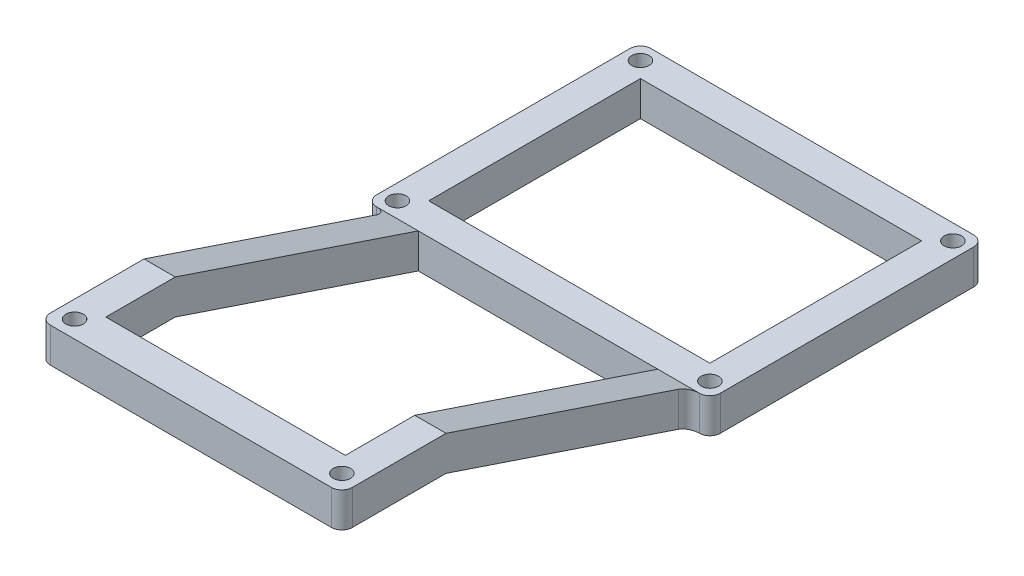
ISO-10303-21;
HEADER;
FILE_DESCRIPTION(('STEP AP214'),'2;1');
FILE_NAME('part.step','',(''),(''),'','','');
FILE_SCHEMA(('AUTOMOTIVE_DESIGN { 1 0 10303 214 1 1 1 1 }'));
ENDSEC;
DATA;
#1=APPLICATION_CONTEXT('core data for automotive mechanical design processes');
#2=APPLICATION_PROTOCOL_DEFINITION('international standard','automotive_design',2000,#1);
#3=PRODUCT_CONTEXT('',#1,'mechanical');
#4=PRODUCT('Part','Part','',(#3));
#5=PRODUCT_RELATED_PRODUCT_CATEGORY('part','',(#4));
#6=PRODUCT_DEFINITION_FORMATION('','',#4);
#7=PRODUCT_DEFINITION_CONTEXT('part definition',#1,'design');
#8=PRODUCT_DEFINITION('design','',#6,#7);
#9=PRODUCT_DEFINITION_SHAPE('','',#8);
#10=(LENGTH_UNIT() NAMED_UNIT(*) SI_UNIT(.MILLI.,.METRE.));
#11=(NAMED_UNIT(*) PLANE_ANGLE_UNIT() SI_UNIT($,.RADIAN.));
#12=(NAMED_UNIT(*) SI_UNIT($,.STERADIAN.) SOLID_ANGLE_UNIT());
#13=UNCERTAINTY_MEASURE_WITH_UNIT(LENGTH_MEASURE(1.E-05),#10,'distance_accuracy_value','');
#14=(GEOMETRIC_REPRESENTATION_CONTEXT(3) GLOBAL_UNCERTAINTY_ASSIGNED_CONTEXT((#13)) GLOBAL_UNIT_ASSIGNED_CONTEXT((#10,
#11,#12)) REPRESENTATION_CONTEXT('',''));
#15=CARTESIAN_POINT('',(0.,0.,0.));
#16=DIRECTION('',(0.,0.,1.));
#17=DIRECTION('',(1.,0.,0.));
#18=AXIS2_PLACEMENT_3D('',#15,#16,#17);
#19=CARTESIAN_POINT('',(84.,0.,0.));
#20=DIRECTION('',(-1.,0.,0.));
#21=DIRECTION('',(0.,0.,1.));
#22=AXIS2_PLACEMENT_3D('',#19,#20,#21);
#23=PLANE('',#22);
#24=DIRECTION('',(0.,0.,-1.));
#25=VECTOR('',#24,1.);
#26=CARTESIAN_POINT('',(84.,23.5,149.));
#27=LINE('',#26,#25);
#28=CARTESIAN_POINT('',(84.,23.5,169.));
#29=VERTEX_POINT('',#28);
#30=CARTESIAN_POINT('',(84.,23.5,149.));
#31=VERTEX_POINT('',#30);
#32=EDGE_CURVE('E301',#29,#31,#27,.T.);
#33=ORIENTED_EDGE('',*,*,#32,.F.);
#34=DIRECTION('',(0.,-1.,0.));
#35=VECTOR('',#34,1.);
#36=CARTESIAN_POINT('',(84.,23.5,169.));
#37=LINE('',#36,#35);
#38=CARTESIAN_POINT('',(84.,33.5,169.));
#39=VERTEX_POINT('',#38);
#40=EDGE_CURVE('E236',#39,#29,#37,.T.);
#41=ORIENTED_EDGE('',*,*,#40,.F.);
#42=DIRECTION('',(0.,0.,1.));
#43=VECTOR('',#42,1.);
#44=CARTESIAN_POINT('',(84.,33.5,149.));
#45=LINE('',#44,#43);
#46=CARTESIAN_POINT('',(84.,33.5,149.));
#47=VERTEX_POINT('',#46);
#48=EDGE_CURVE('E297',#47,#39,#45,.T.);
#49=ORIENTED_EDGE('',*,*,#48,.F.);
#50=DIRECTION('',(0.,0.318258478116636,0.948003977368704));
#51=VECTOR('',#50,1.);
#52=CARTESIAN_POINT('',(84.,33.5,149.));
#53=LINE('',#52,#51);
#54=CARTESIAN_POINT('',(84.,10.,79.));
#55=VERTEX_POINT('',#54);
#56=EDGE_CURVE('E293',#55,#47,#53,.T.);
#57=ORIENTED_EDGE('',*,*,#56,.F.);
#58=DIRECTION('',(0.,1.,0.));
#59=VECTOR('',#58,1.);
#60=CARTESIAN_POINT('',(84.,10.,79.));
#61=LINE('',#60,#59);
#62=CARTESIAN_POINT('',(84.,0.,79.));
#63=VERTEX_POINT('',#62);
#64=EDGE_CURVE('E287',#63,#55,#61,.T.);
#65=ORIENTED_EDGE('',*,*,#64,.F.);
#66=DIRECTION('',(0.,-0.318258478116636,-0.948003977368704));
#67=VECTOR('',#66,1.);
#68=CARTESIAN_POINT('',(84.,0.,79.));
#69=LINE('',#68,#67);
#70=EDGE_CURVE('E304',#31,#63,#69,.T.);
#71=ORIENTED_EDGE('',*,*,#70,.F.);
#72=EDGE_LOOP('',(#33,#41,#49,#57,#65,#71));
#73=FACE_BOUND('',#72,.T.);
#74=ADVANCED_FACE('F38',(#73),#23,.T.);
#75=CARTESIAN_POINT('',(15.,0.,0.));
#76=DIRECTION('',(1.,0.,0.));
#77=DIRECTION('',(0.,0.,1.));
#78=AXIS2_PLACEMENT_3D('',#75,#76,#77);
#79=PLANE('',#78);
#80=DIRECTION('',(0.,0.,1.));
#81=VECTOR('',#80,1.);
#82=CARTESIAN_POINT('',(15.,33.5,149.));
#83=LINE('',#82,#81);
#84=CARTESIAN_POINT('',(15.,33.5,149.));
#85=VERTEX_POINT('',#84);
#86=CARTESIAN_POINT('',(15.,33.5,169.));
#87=VERTEX_POINT('',#86);
#88=EDGE_CURVE('E221',#85,#87,#83,.T.);
#89=ORIENTED_EDGE('',*,*,#88,.T.);
#90=DIRECTION('',(0.,1.,0.));
#91=VECTOR('',#90,1.);
#92=CARTESIAN_POINT('',(15.,23.5,169.));
#93=LINE('',#92,#91);
#94=CARTESIAN_POINT('',(15.,23.5,169.));
#95=VERTEX_POINT('',#94);
#96=EDGE_CURVE('E225',#95,#87,#93,.T.);
#97=ORIENTED_EDGE('',*,*,#96,.F.);
#98=DIRECTION('',(0.,0.,-1.));
#99=VECTOR('',#98,1.);
#100=CARTESIAN_POINT('',(15.,23.5,149.));
#101=LINE('',#100,#99);
#102=CARTESIAN_POINT('',(15.,23.5,149.));
#103=VERTEX_POINT('',#102);
#104=EDGE_CURVE('E208',#95,#103,#101,.T.);
#105=ORIENTED_EDGE('',*,*,#104,.T.);
#106=DIRECTION('',(0.,-0.318258478116636,-0.948003977368704));
#107=VECTOR('',#106,1.);
#108=CARTESIAN_POINT('',(15.,0.,79.));
#109=LINE('',#108,#107);
#110=CARTESIAN_POINT('',(15.,0.,79.));
#111=VERTEX_POINT('',#110);
#112=EDGE_CURVE('E222',#103,#111,#109,.T.);
#113=ORIENTED_EDGE('',*,*,#112,.T.);
#114=DIRECTION('',(0.,1.,0.));
#115=VECTOR('',#114,1.);
#116=CARTESIAN_POINT('',(15.,10.,79.));
#117=LINE('',#116,#115);
#118=CARTESIAN_POINT('',(15.,10.,79.));
#119=VERTEX_POINT('',#118);
#120=EDGE_CURVE('E272',#111,#119,#117,.T.);
#121=ORIENTED_EDGE('',*,*,#120,.T.);
#122=DIRECTION('',(0.,0.318258478116636,0.948003977368704));
#123=VECTOR('',#122,1.);
#124=CARTESIAN_POINT('',(15.,33.5,149.));
#125=LINE('',#124,#123);
#126=EDGE_CURVE('E280',#119,#85,#125,.T.);
#127=ORIENTED_EDGE('',*,*,#126,.T.);
#128=EDGE_LOOP('',(#89,#97,#105,#113,#121,#127));
#129=FACE_BOUND('',#128,.T.);
#130=ADVANCED_FACE('F226',(#129),#79,.T.);
#131=CARTESIAN_POINT('',(0.,10.,0.));
#132=DIRECTION('',(1.,0.,0.));
#133=DIRECTION('',(0.,0.,-1.));
#134=AXIS2_PLACEMENT_3D('',#131,#132,#133);
#135=PLANE('',#134);
#136=DIRECTION('',(0.,0.,1.));
#137=VECTOR('',#136,1.);
#138=CARTESIAN_POINT('',(0.,10.,0.));
#139=LINE('',#138,#137);
#140=CARTESIAN_POINT('',(0.,10.,3.));
#141=VERTEX_POINT('',#140);
#142=CARTESIAN_POINT('',(0.,10.,76.));
#143=VERTEX_POINT('',#142);
#144=EDGE_CURVE('E406',#141,#143,#139,.T.);
#145=ORIENTED_EDGE('',*,*,#144,.F.);
#146=DIRECTION('',(0.,-1.,0.));
#147=VECTOR('',#146,1.);
#148=CARTESIAN_POINT('',(0.,10.,3.));
#149=LINE('',#148,#147);
#150=CARTESIAN_POINT('',(0.,0.,3.));
#151=VERTEX_POINT('',#150);
#152=EDGE_CURVE('E494',#141,#151,#149,.T.);
#153=ORIENTED_EDGE('',*,*,#152,.T.);
#154=DIRECTION('',(0.,0.,1.));
#155=VECTOR('',#154,1.);
#156=CARTESIAN_POINT('',(0.,0.,0.));
#157=LINE('',#156,#155);
#158=CARTESIAN_POINT('',(0.,0.,76.));
#159=VERTEX_POINT('',#158);
#160=EDGE_CURVE('E405',#151,#159,#157,.T.);
#161=ORIENTED_EDGE('',*,*,#160,.T.);
#162=DIRECTION('',(0.,1.,0.));
#163=VECTOR('',#162,1.);
#164=CARTESIAN_POINT('',(0.,10.,76.));
#165=LINE('',#164,#163);
#166=EDGE_CURVE('E491',#159,#143,#165,.T.);
#167=ORIENTED_EDGE('',*,*,#166,.T.);
#168=EDGE_LOOP('',(#145,#153,#161,#167));
#169=FACE_BOUND('',#168,.T.);
#170=ADVANCED_FACE('F581',(#169),#135,.F.);
#171=CARTESIAN_POINT('',(0.,10.,0.));
#172=DIRECTION('',(0.,1.,0.));
#173=DIRECTION('',(0.,0.,1.));
#174=AXIS2_PLACEMENT_3D('',#171,#172,#173);
#175=PLANE('',#174);
#176=CARTESIAN_POINT('',(4.5,10.,74.5));
#177=DIRECTION('',(0.,1.,0.));
#178=DIRECTION('',(0.,0.,1.));
#179=AXIS2_PLACEMENT_3D('',#176,#177,#178);
#180=CIRCLE('',#179,2.5);
#181=CARTESIAN_POINT('',(4.5,10.,77.));
#182=VERTEX_POINT('',#181);
#183=EDGE_CURVE('E339',#182,#182,#180,.T.);
#184=ORIENTED_EDGE('',*,*,#183,.F.);
#185=EDGE_LOOP('',(#184));
#186=FACE_BOUND('',#185,.T.);
#187=CARTESIAN_POINT('',(94.5,10.,4.5));
#188=DIRECTION('',(0.,1.,0.));
#189=DIRECTION('',(0.,0.,1.));
#190=AXIS2_PLACEMENT_3D('',#187,#188,#189);
#191=CIRCLE('',#190,2.5);
#192=CARTESIAN_POINT('',(94.5,10.,6.99999999999999));
#193=VERTEX_POINT('',#192);
#194=EDGE_CURVE('E355',#193,#193,#191,.T.);
#195=ORIENTED_EDGE('',*,*,#194,.F.);
#196=EDGE_LOOP('',(#195));
#197=FACE_BOUND('',#196,.T.);
#198=DIRECTION('',(0.,0.,-1.));
#199=VECTOR('',#198,1.);
#200=CARTESIAN_POINT('',(99.,10.,0.));
#201=LINE('',#200,#199);
#202=CARTESIAN_POINT('',(99.,10.,76.));
#203=VERTEX_POINT('',#202);
#204=CARTESIAN_POINT('',(99.,10.,3.));
#205=VERTEX_POINT('',#204);
#206=EDGE_CURVE('E415',#203,#205,#201,.T.);
#207=ORIENTED_EDGE('',*,*,#206,.T.);
#208=CARTESIAN_POINT('',(96.,10.,3.));
#209=DIRECTION('',(0.,1.,0.));
#210=DIRECTION('',(0.,0.,1.));
#211=AXIS2_PLACEMENT_3D('',#208,#209,#210);
#212=CIRCLE('',#211,3.);
#213=CARTESIAN_POINT('',(96.,10.,0.));
#214=VERTEX_POINT('',#213);
#215=EDGE_CURVE('E488',#205,#214,#212,.T.);
#216=ORIENTED_EDGE('',*,*,#215,.T.);
#217=DIRECTION('',(-1.,0.,0.));
#218=VECTOR('',#217,1.);
#219=CARTESIAN_POINT('',(0.,10.,0.));
#220=LINE('',#219,#218);
#221=CARTESIAN_POINT('',(3.,10.,0.));
#222=VERTEX_POINT('',#221);
#223=EDGE_CURVE('E419',#214,#222,#220,.T.);
#224=ORIENTED_EDGE('',*,*,#223,.T.);
#225=CARTESIAN_POINT('',(3.,10.,3.));
#226=DIRECTION('',(0.,1.,0.));
#227=DIRECTION('',(0.,0.,1.));
#228=AXIS2_PLACEMENT_3D('',#225,#226,#227);
#229=CIRCLE('',#228,3.);
#230=EDGE_CURVE('E485',#222,#141,#229,.T.);
#231=ORIENTED_EDGE('',*,*,#230,.T.);
#232=ORIENTED_EDGE('',*,*,#144,.T.);
#233=CARTESIAN_POINT('',(3.00000000000001,10.,76.));
#234=DIRECTION('',(0.,1.,0.));
#235=DIRECTION('',(0.,0.,1.));
#236=AXIS2_PLACEMENT_3D('',#233,#234,#235);
#237=CIRCLE('',#236,3.);
#238=CARTESIAN_POINT('',(3.00000000000001,10.,79.));
#239=VERTEX_POINT('',#238);
#240=EDGE_CURVE('E478',#143,#239,#237,.T.);
#241=ORIENTED_EDGE('',*,*,#240,.T.);
#242=DIRECTION('',(1.,0.,0.));
#243=VECTOR('',#242,1.);
#244=CARTESIAN_POINT('',(0.,10.,79.));
#245=LINE('',#244,#243);
#246=EDGE_CURVE('E412',#239,#119,#245,.T.);
#247=ORIENTED_EDGE('',*,*,#246,.T.);
#248=EDGE_CURVE('E410',#119,#55,#245,.T.);
#249=ORIENTED_EDGE('',*,*,#248,.T.);
#250=DIRECTION('',(1.,0.,0.));
#251=VECTOR('',#250,1.);
#252=CARTESIAN_POINT('',(84.,10.,79.));
#253=LINE('',#252,#251);
#254=CARTESIAN_POINT('',(96.,10.,79.));
#255=VERTEX_POINT('',#254);
#256=EDGE_CURVE('E57',#55,#255,#253,.T.);
#257=ORIENTED_EDGE('',*,*,#256,.T.);
#258=CARTESIAN_POINT('',(96.,10.,76.));
#259=DIRECTION('',(0.,1.,0.));
#260=DIRECTION('',(0.,0.,1.));
#261=AXIS2_PLACEMENT_3D('',#258,#259,#260);
#262=CIRCLE('',#261,3.);
#263=EDGE_CURVE('E482',#255,#203,#262,.T.);
#264=ORIENTED_EDGE('',*,*,#263,.T.);
#265=EDGE_LOOP('',(#207,#216,#224,#231,#232,#241,#247,#249,#257,#264));
#266=FACE_BOUND('',#265,.T.);
#267=DIRECTION('',(1.,0.,0.));
#268=VECTOR('',#267,1.);
#269=CARTESIAN_POINT('',(9.00000000000003,10.,70.));
#270=LINE('',#269,#268);
#271=CARTESIAN_POINT('',(9.00000000000003,10.,70.));
#272=VERTEX_POINT('',#271);
#273=CARTESIAN_POINT('',(90.0000000000001,10.,70.));
#274=VERTEX_POINT('',#273);
#275=EDGE_CURVE('E366',#272,#274,#270,.T.);
#276=ORIENTED_EDGE('',*,*,#275,.F.);
#277=DIRECTION('',(0.,0.,1.));
#278=VECTOR('',#277,1.);
#279=CARTESIAN_POINT('',(9.00000000000002,10.,9.));
#280=LINE('',#279,#278);
#281=CARTESIAN_POINT('',(9.00000000000002,10.,9.));
#282=VERTEX_POINT('',#281);
#283=EDGE_CURVE('E363',#282,#272,#280,.T.);
#284=ORIENTED_EDGE('',*,*,#283,.F.);
#285=DIRECTION('',(-1.,0.,0.));
#286=VECTOR('',#285,1.);
#287=CARTESIAN_POINT('',(9.00000000000002,10.,9.));
#288=LINE('',#287,#286);
#289=CARTESIAN_POINT('',(90.,10.,9.));
#290=VERTEX_POINT('',#289);
#291=EDGE_CURVE('E374',#290,#282,#288,.T.);
#292=ORIENTED_EDGE('',*,*,#291,.F.);
#293=DIRECTION('',(0.,0.,-1.));
#294=VECTOR('',#293,1.);
#295=CARTESIAN_POINT('',(90.,10.,9.));
#296=LINE('',#295,#294);
#297=EDGE_CURVE('E370',#274,#290,#296,.T.);
#298=ORIENTED_EDGE('',*,*,#297,.F.);
#299=EDGE_LOOP('',(#276,#284,#292,#298));
#300=FACE_BOUND('',#299,.T.);
#301=CARTESIAN_POINT('',(4.5,10.,4.5));
#302=DIRECTION('',(0.,1.,0.));
#303=DIRECTION('',(0.,0.,1.));
#304=AXIS2_PLACEMENT_3D('',#301,#302,#303);
#305=CIRCLE('',#304,2.5);
#306=CARTESIAN_POINT('',(4.5,10.,7.));
#307=VERTEX_POINT('',#306);
#308=EDGE_CURVE('E347',#307,#307,#305,.T.);
#309=ORIENTED_EDGE('',*,*,#308,.F.);
#310=EDGE_LOOP('',(#309));
#311=FACE_BOUND('',#310,.T.);
#312=CARTESIAN_POINT('',(94.5,10.,74.5));
#313=DIRECTION('',(0.,1.,0.));
#314=DIRECTION('',(0.,0.,1.));
#315=AXIS2_PLACEMENT_3D('',#312,#313,#314);
#316=CIRCLE('',#315,2.5);
#317=CARTESIAN_POINT('',(94.5,10.,77.));
#318=VERTEX_POINT('',#317);
#319=EDGE_CURVE('E331',#318,#318,#316,.T.);
#320=ORIENTED_EDGE('',*,*,#319,.F.);
#321=EDGE_LOOP('',(#320));
#322=FACE_BOUND('',#321,.T.);
#323=ADVANCED_FACE('F569',(#186,#197,#266,#300,#311,#322),#175,.T.);
#324=CARTESIAN_POINT('',(0.,0.,0.));
#325=DIRECTION('',(0.,1.,0.));
#326=DIRECTION('',(0.,0.,1.));
#327=AXIS2_PLACEMENT_3D('',#324,#325,#326);
#328=PLANE('',#327);
#329=DIRECTION('',(-1.,0.,0.));
#330=VECTOR('',#329,1.);
#331=CARTESIAN_POINT('',(0.,0.,0.));
#332=LINE('',#331,#330);
#333=CARTESIAN_POINT('',(96.,0.,0.));
#334=VERTEX_POINT('',#333);
#335=CARTESIAN_POINT('',(3.,0.,0.));
#336=VERTEX_POINT('',#335);
#337=EDGE_CURVE('E411',#334,#336,#332,.T.);
#338=ORIENTED_EDGE('',*,*,#337,.F.);
#339=CARTESIAN_POINT('',(96.,0.,3.));
#340=DIRECTION('',(0.,1.,0.));
#341=DIRECTION('',(0.,0.,1.));
#342=AXIS2_PLACEMENT_3D('',#339,#340,#341);
#343=CIRCLE('',#342,3.);
#344=CARTESIAN_POINT('',(99.,0.,3.));
#345=VERTEX_POINT('',#344);
#346=EDGE_CURVE('E469',#334,#345,#343,.F.);
#347=ORIENTED_EDGE('',*,*,#346,.T.);
#348=DIRECTION('',(0.,0.,-1.));
#349=VECTOR('',#348,1.);
#350=CARTESIAN_POINT('',(99.,0.,0.));
#351=LINE('',#350,#349);
#352=CARTESIAN_POINT('',(99.,0.,76.));
#353=VERTEX_POINT('',#352);
#354=EDGE_CURVE('E431',#353,#345,#351,.T.);
#355=ORIENTED_EDGE('',*,*,#354,.F.);
#356=CARTESIAN_POINT('',(96.,0.,76.));
#357=DIRECTION('',(0.,1.,0.));
#358=DIRECTION('',(0.,0.,1.));
#359=AXIS2_PLACEMENT_3D('',#356,#357,#358);
#360=CIRCLE('',#359,3.);
#361=CARTESIAN_POINT('',(96.,0.,79.));
#362=VERTEX_POINT('',#361);
#363=EDGE_CURVE('E462',#353,#362,#360,.F.);
#364=ORIENTED_EDGE('',*,*,#363,.T.);
#365=DIRECTION('',(1.,0.,0.));
#366=VECTOR('',#365,1.);
#367=CARTESIAN_POINT('',(84.,0.,79.));
#368=LINE('',#367,#366);
#369=EDGE_CURVE('E308',#63,#362,#368,.T.);
#370=ORIENTED_EDGE('',*,*,#369,.F.);
#371=DIRECTION('',(1.,0.,0.));
#372=VECTOR('',#371,1.);
#373=CARTESIAN_POINT('',(0.,0.,79.));
#374=LINE('',#373,#372);
#375=EDGE_CURVE('E427',#111,#63,#374,.T.);
#376=ORIENTED_EDGE('',*,*,#375,.F.);
#377=CARTESIAN_POINT('',(3.00000000000001,0.,79.));
#378=VERTEX_POINT('',#377);
#379=EDGE_CURVE('E428',#378,#111,#374,.T.);
#380=ORIENTED_EDGE('',*,*,#379,.F.);
#381=CARTESIAN_POINT('',(3.00000000000001,0.,76.));
#382=DIRECTION('',(0.,1.,0.));
#383=DIRECTION('',(0.,0.,1.));
#384=AXIS2_PLACEMENT_3D('',#381,#382,#383);
#385=CIRCLE('',#384,3.);
#386=EDGE_CURVE('E459',#378,#159,#385,.F.);
#387=ORIENTED_EDGE('',*,*,#386,.T.);
#388=ORIENTED_EDGE('',*,*,#160,.F.);
#389=CARTESIAN_POINT('',(3.,0.,3.));
#390=DIRECTION('',(0.,1.,0.));
#391=DIRECTION('',(0.,0.,1.));
#392=AXIS2_PLACEMENT_3D('',#389,#390,#391);
#393=CIRCLE('',#392,3.);
#394=EDGE_CURVE('E466',#151,#336,#393,.F.);
#395=ORIENTED_EDGE('',*,*,#394,.T.);
#396=EDGE_LOOP('',(#338,#347,#355,#364,#370,#376,#380,#387,#388,#395));
#397=FACE_BOUND('',#396,.T.);
#398=DIRECTION('',(0.,0.,1.));
#399=VECTOR('',#398,1.);
#400=CARTESIAN_POINT('',(9.00000000000002,0.,9.));
#401=LINE('',#400,#399);
#402=CARTESIAN_POINT('',(9.00000000000002,0.,9.));
#403=VERTEX_POINT('',#402);
#404=CARTESIAN_POINT('',(9.00000000000003,0.,70.));
#405=VERTEX_POINT('',#404);
#406=EDGE_CURVE('E359',#403,#405,#401,.T.);
#407=ORIENTED_EDGE('',*,*,#406,.T.);
#408=DIRECTION('',(1.,0.,0.));
#409=VECTOR('',#408,1.);
#410=CARTESIAN_POINT('',(9.00000000000003,0.,70.));
#411=LINE('',#410,#409);
#412=CARTESIAN_POINT('',(90.0000000000001,0.,70.));
#413=VERTEX_POINT('',#412);
#414=EDGE_CURVE('E381',#405,#413,#411,.T.);
#415=ORIENTED_EDGE('',*,*,#414,.T.);
#416=DIRECTION('',(0.,0.,-1.));
#417=VECTOR('',#416,1.);
#418=CARTESIAN_POINT('',(90.,0.,9.));
#419=LINE('',#418,#417);
#420=CARTESIAN_POINT('',(90.,0.,9.));
#421=VERTEX_POINT('',#420);
#422=EDGE_CURVE('E385',#413,#421,#419,.T.);
#423=ORIENTED_EDGE('',*,*,#422,.T.);
#424=DIRECTION('',(-1.,0.,0.));
#425=VECTOR('',#424,1.);
#426=CARTESIAN_POINT('',(9.00000000000002,0.,9.));
#427=LINE('',#426,#425);
#428=EDGE_CURVE('E367',#421,#403,#427,.T.);
#429=ORIENTED_EDGE('',*,*,#428,.T.);
#430=EDGE_LOOP('',(#407,#415,#423,#429));
#431=FACE_BOUND('',#430,.T.);
#432=CARTESIAN_POINT('',(94.5,0.,4.5));
#433=DIRECTION('',(0.,1.,0.));
#434=DIRECTION('',(0.,0.,1.));
#435=AXIS2_PLACEMENT_3D('',#432,#433,#434);
#436=CIRCLE('',#435,2.5);
#437=CARTESIAN_POINT('',(94.5,0.,6.99999999999999));
#438=VERTEX_POINT('',#437);
#439=EDGE_CURVE('E351',#438,#438,#436,.T.);
#440=ORIENTED_EDGE('',*,*,#439,.T.);
#441=EDGE_LOOP('',(#440));
#442=FACE_BOUND('',#441,.T.);
#443=CARTESIAN_POINT('',(4.5,0.,4.5));
#444=DIRECTION('',(0.,1.,0.));
#445=DIRECTION('',(0.,0.,1.));
#446=AXIS2_PLACEMENT_3D('',#443,#444,#445);
#447=CIRCLE('',#446,2.5);
#448=CARTESIAN_POINT('',(4.5,0.,7.));
#449=VERTEX_POINT('',#448);
#450=EDGE_CURVE('E343',#449,#449,#447,.T.);
#451=ORIENTED_EDGE('',*,*,#450,.T.);
#452=EDGE_LOOP('',(#451));
#453=FACE_BOUND('',#452,.T.);
#454=CARTESIAN_POINT('',(4.5,0.,74.5));
#455=DIRECTION('',(0.,1.,0.));
#456=DIRECTION('',(0.,0.,1.));
#457=AXIS2_PLACEMENT_3D('',#454,#455,#456);
#458=CIRCLE('',#457,2.5);
#459=CARTESIAN_POINT('',(4.5,0.,77.));
#460=VERTEX_POINT('',#459);
#461=EDGE_CURVE('E335',#460,#460,#458,.T.);
#462=ORIENTED_EDGE('',*,*,#461,.T.);
#463=EDGE_LOOP('',(#462));
#464=FACE_BOUND('',#463,.T.);
#465=CARTESIAN_POINT('',(94.5,0.,74.5));
#466=DIRECTION('',(0.,1.,0.));
#467=DIRECTION('',(0.,0.,1.));
#468=AXIS2_PLACEMENT_3D('',#465,#466,#467);
#469=CIRCLE('',#468,2.5);
#470=CARTESIAN_POINT('',(94.5,0.,77.));
#471=VERTEX_POINT('',#470);
#472=EDGE_CURVE('E312',#471,#471,#469,.T.);
#473=ORIENTED_EDGE('',*,*,#472,.T.);
#474=EDGE_LOOP('',(#473));
#475=FACE_BOUND('',#474,.T.);
#476=ADVANCED_FACE('F558',(#397,#431,#442,#453,#464,#475),#328,.F.);
#477=CARTESIAN_POINT('',(0.,10.,79.));
#478=DIRECTION('',(0.,0.,-1.));
#479=DIRECTION('',(-1.,0.,0.));
#480=AXIS2_PLACEMENT_3D('',#477,#478,#479);
#481=PLANE('',#480);
#482=ORIENTED_EDGE('',*,*,#248,.F.);
#483=ORIENTED_EDGE('',*,*,#120,.F.);
#484=ORIENTED_EDGE('',*,*,#375,.T.);
#485=ORIENTED_EDGE('',*,*,#64,.T.);
#486=EDGE_LOOP('',(#482,#483,#484,#485));
#487=FACE_BOUND('',#486,.T.);
#488=ADVANCED_FACE('F593',(#487),#481,.F.);
#489=CARTESIAN_POINT('',(99.,10.,0.));
#490=DIRECTION('',(-1.,0.,0.));
#491=DIRECTION('',(0.,0.,1.));
#492=AXIS2_PLACEMENT_3D('',#489,#490,#491);
#493=PLANE('',#492);
#494=ORIENTED_EDGE('',*,*,#354,.T.);
#495=DIRECTION('',(0.,-1.,0.));
#496=VECTOR('',#495,1.);
#497=CARTESIAN_POINT('',(99.,10.,3.));
#498=LINE('',#497,#496);
#499=EDGE_CURVE('E475',#345,#205,#498,.F.);
#500=ORIENTED_EDGE('',*,*,#499,.T.);
#501=ORIENTED_EDGE('',*,*,#206,.F.);
#502=DIRECTION('',(0.,1.,0.));
#503=VECTOR('',#502,1.);
#504=CARTESIAN_POINT('',(99.,10.,76.));
#505=LINE('',#504,#503);
#506=EDGE_CURVE('E472',#203,#353,#505,.F.);
#507=ORIENTED_EDGE('',*,*,#506,.T.);
#508=EDGE_LOOP('',(#494,#500,#501,#507));
#509=FACE_BOUND('',#508,.T.);
#510=ADVANCED_FACE('F562',(#509),#493,.F.);
#511=CARTESIAN_POINT('',(0.,10.,0.));
#512=DIRECTION('',(0.,0.,1.));
#513=DIRECTION('',(1.,0.,0.));
#514=AXIS2_PLACEMENT_3D('',#511,#512,#513);
#515=PLANE('',#514);
#516=ORIENTED_EDGE('',*,*,#223,.F.);
#517=DIRECTION('',(0.,-1.,0.));
#518=VECTOR('',#517,1.);
#519=CARTESIAN_POINT('',(96.,10.,0.));
#520=LINE('',#519,#518);
#521=EDGE_CURVE('E455',#214,#334,#520,.T.);
#522=ORIENTED_EDGE('',*,*,#521,.T.);
#523=ORIENTED_EDGE('',*,*,#337,.T.);
#524=DIRECTION('',(0.,-1.,0.));
#525=VECTOR('',#524,1.);
#526=CARTESIAN_POINT('',(3.,10.,0.));
#527=LINE('',#526,#525);
#528=EDGE_CURVE('E452',#336,#222,#527,.F.);
#529=ORIENTED_EDGE('',*,*,#528,.T.);
#530=EDGE_LOOP('',(#516,#522,#523,#529));
#531=FACE_BOUND('',#530,.T.);
#532=ADVANCED_FACE('F573',(#531),#515,.F.);
#533=CARTESIAN_POINT('',(9.00000000000002,10.,9.));
#534=DIRECTION('',(1.,0.,0.));
#535=DIRECTION('',(0.,0.,-1.));
#536=AXIS2_PLACEMENT_3D('',#533,#534,#535);
#537=PLANE('',#536);
#538=ORIENTED_EDGE('',*,*,#406,.F.);
#539=DIRECTION('',(0.,-1.,0.));
#540=VECTOR('',#539,1.);
#541=CARTESIAN_POINT('',(9.00000000000002,10.,9.));
#542=LINE('',#541,#540);
#543=EDGE_CURVE('E377',#282,#403,#542,.T.);
#544=ORIENTED_EDGE('',*,*,#543,.F.);
#545=ORIENTED_EDGE('',*,*,#283,.T.);
#546=DIRECTION('',(0.,-1.,0.));
#547=VECTOR('',#546,1.);
#548=CARTESIAN_POINT('',(9.00000000000003,10.,70.));
#549=LINE('',#548,#547);
#550=EDGE_CURVE('E401',#272,#405,#549,.T.);
#551=ORIENTED_EDGE('',*,*,#550,.T.);
#552=EDGE_LOOP('',(#538,#544,#545,#551));
#553=FACE_BOUND('',#552,.T.);
#554=ADVANCED_FACE('F691',(#553),#537,.T.);
#555=CARTESIAN_POINT('',(9.00000000000003,10.,70.));
#556=DIRECTION('',(0.,0.,-1.));
#557=DIRECTION('',(-1.,0.,0.));
#558=AXIS2_PLACEMENT_3D('',#555,#556,#557);
#559=PLANE('',#558);
#560=ORIENTED_EDGE('',*,*,#414,.F.);
#561=ORIENTED_EDGE('',*,*,#550,.F.);
#562=ORIENTED_EDGE('',*,*,#275,.T.);
#563=DIRECTION('',(0.,-1.,0.));
#564=VECTOR('',#563,1.);
#565=CARTESIAN_POINT('',(90.0000000000001,10.,70.));
#566=LINE('',#565,#564);
#567=EDGE_CURVE('E398',#274,#413,#566,.T.);
#568=ORIENTED_EDGE('',*,*,#567,.T.);
#569=EDGE_LOOP('',(#560,#561,#562,#568));
#570=FACE_BOUND('',#569,.T.);
#571=ADVANCED_FACE('F687',(#570),#559,.T.);
#572=CARTESIAN_POINT('',(90.,10.,9.));
#573=DIRECTION('',(-1.,0.,0.));
#574=DIRECTION('',(0.,0.,1.));
#575=AXIS2_PLACEMENT_3D('',#572,#573,#574);
#576=PLANE('',#575);
#577=ORIENTED_EDGE('',*,*,#422,.F.);
#578=ORIENTED_EDGE('',*,*,#567,.F.);
#579=ORIENTED_EDGE('',*,*,#297,.T.);
#580=DIRECTION('',(0.,-1.,0.));
#581=VECTOR('',#580,1.);
#582=CARTESIAN_POINT('',(90.,10.,9.));
#583=LINE('',#582,#581);
#584=EDGE_CURVE('E395',#290,#421,#583,.T.);
#585=ORIENTED_EDGE('',*,*,#584,.T.);
#586=EDGE_LOOP('',(#577,#578,#579,#585));
#587=FACE_BOUND('',#586,.T.);
#588=ADVANCED_FACE('F683',(#587),#576,.T.);
#589=CARTESIAN_POINT('',(9.00000000000002,10.,9.));
#590=DIRECTION('',(0.,0.,1.));
#591=DIRECTION('',(1.,0.,0.));
#592=AXIS2_PLACEMENT_3D('',#589,#590,#591);
#593=PLANE('',#592);
#594=ORIENTED_EDGE('',*,*,#428,.F.);
#595=ORIENTED_EDGE('',*,*,#584,.F.);
#596=ORIENTED_EDGE('',*,*,#291,.T.);
#597=ORIENTED_EDGE('',*,*,#543,.T.);
#598=EDGE_LOOP('',(#594,#595,#596,#597));
#599=FACE_BOUND('',#598,.T.);
#600=ADVANCED_FACE('F679',(#599),#593,.T.);
#601=CARTESIAN_POINT('',(94.5,10.,4.5));
#602=DIRECTION('',(0.,-1.,0.));
#603=DIRECTION('',(0.,0.,-1.));
#604=AXIS2_PLACEMENT_3D('',#601,#602,#603);
#605=CYLINDRICAL_SURFACE('',#604,2.5);
#606=ORIENTED_EDGE('',*,*,#194,.T.);
#607=EDGE_LOOP('',(#606));
#608=FACE_BOUND('',#607,.T.);
#609=ORIENTED_EDGE('',*,*,#439,.F.);
#610=EDGE_LOOP('',(#609));
#611=FACE_BOUND('',#610,.T.);
#612=ADVANCED_FACE('F675',(#608,#611),#605,.F.);
#613=CARTESIAN_POINT('',(4.5,10.,4.5));
#614=DIRECTION('',(0.,-1.,0.));
#615=DIRECTION('',(0.,0.,-1.));
#616=AXIS2_PLACEMENT_3D('',#613,#614,#615);
#617=CYLINDRICAL_SURFACE('',#616,2.5);
#618=ORIENTED_EDGE('',*,*,#308,.T.);
#619=EDGE_LOOP('',(#618));
#620=FACE_BOUND('',#619,.T.);
#621=ORIENTED_EDGE('',*,*,#450,.F.);
#622=EDGE_LOOP('',(#621));
#623=FACE_BOUND('',#622,.T.);
#624=ADVANCED_FACE('F671',(#620,#623),#617,.F.);
#625=CARTESIAN_POINT('',(4.5,10.,74.5));
#626=DIRECTION('',(0.,-1.,0.));
#627=DIRECTION('',(0.,0.,-1.));
#628=AXIS2_PLACEMENT_3D('',#625,#626,#627);
#629=CYLINDRICAL_SURFACE('',#628,2.5);
#630=ORIENTED_EDGE('',*,*,#183,.T.);
#631=EDGE_LOOP('',(#630));
#632=FACE_BOUND('',#631,.T.);
#633=ORIENTED_EDGE('',*,*,#461,.F.);
#634=EDGE_LOOP('',(#633));
#635=FACE_BOUND('',#634,.T.);
#636=ADVANCED_FACE('F667',(#632,#635),#629,.F.);
#637=CARTESIAN_POINT('',(94.5,10.,74.5));
#638=DIRECTION('',(0.,-1.,0.));
#639=DIRECTION('',(0.,0.,-1.));
#640=AXIS2_PLACEMENT_3D('',#637,#638,#639);
#641=CYLINDRICAL_SURFACE('',#640,2.5);
#642=ORIENTED_EDGE('',*,*,#319,.T.);
#643=EDGE_LOOP('',(#642));
#644=FACE_BOUND('',#643,.T.);
#645=ORIENTED_EDGE('',*,*,#472,.F.);
#646=EDGE_LOOP('',(#645));
#647=FACE_BOUND('',#646,.T.);
#648=ADVANCED_FACE('F654',(#644,#647),#641,.F.);
#649=CARTESIAN_POINT('',(84.,0.,79.));
#650=DIRECTION('',(0.,-0.948003977368704,0.318258478116636));
#651=DIRECTION('',(0.,-0.318258478116636,-0.948003977368704));
#652=AXIS2_PLACEMENT_3D('',#649,#650,#651);
#653=PLANE('',#652);
#654=DIRECTION('',(0.,-0.318258478116636,-0.948003977368704));
#655=VECTOR('',#654,1.);
#656=CARTESIAN_POINT('',(93.,0.,79.));
#657=LINE('',#656,#655);
#658=CARTESIAN_POINT('',(93.,23.5,149.));
#659=VERTEX_POINT('',#658);
#660=CARTESIAN_POINT('',(93.,1.00714285714286,82.));
#661=VERTEX_POINT('',#660);
#662=EDGE_CURVE('E268',#659,#661,#657,.T.);
#663=ORIENTED_EDGE('',*,*,#662,.F.);
#664=DIRECTION('',(1.,0.,0.));
#665=VECTOR('',#664,1.);
#666=CARTESIAN_POINT('',(84.,23.5,149.));
#667=LINE('',#666,#665);
#668=EDGE_CURVE('E313',#31,#659,#667,.T.);
#669=ORIENTED_EDGE('',*,*,#668,.F.);
#670=ORIENTED_EDGE('',*,*,#70,.T.);
#671=ORIENTED_EDGE('',*,*,#369,.T.);
#672=CARTESIAN_POINT('',(96.,1.00714285714286,82.));
#673=DIRECTION('',(0.,-0.948003977368704,0.318258478116636));
#674=DIRECTION('',(0.,-0.318258478116636,-0.948003977368704));
#675=AXIS2_PLACEMENT_3D('',#672,#673,#674);
#676=ELLIPSE('',#675,3.16454368506644,3.);
#677=EDGE_CURVE('E11',#362,#661,#676,.F.);
#678=ORIENTED_EDGE('',*,*,#677,.T.);
#679=EDGE_LOOP('',(#663,#669,#670,#671,#678));
#680=FACE_BOUND('',#679,.T.);
#681=ADVANCED_FACE('F551',(#680),#653,.T.);
#682=CARTESIAN_POINT('',(84.,23.5,149.));
#683=DIRECTION('',(0.,-1.,0.));
#684=DIRECTION('',(0.,0.,-1.));
#685=AXIS2_PLACEMENT_3D('',#682,#683,#684);
#686=PLANE('',#685);
#687=CARTESIAN_POINT('',(88.,23.5,174.));
#688=DIRECTION('',(0.,-1.,0.));
#689=DIRECTION('',(0.,0.,-1.));
#690=AXIS2_PLACEMENT_3D('',#687,#688,#689);
#691=CIRCLE('',#690,2.50000000000001);
#692=CARTESIAN_POINT('',(88.,23.5,171.5));
#693=VERTEX_POINT('',#692);
#694=EDGE_CURVE('E972',#693,#693,#691,.T.);
#695=ORIENTED_EDGE('',*,*,#694,.F.);
#696=EDGE_LOOP('',(#695));
#697=FACE_BOUND('',#696,.T.);
#698=CARTESIAN_POINT('',(11.,23.5,174.));
#699=DIRECTION('',(0.,-1.,0.));
#700=DIRECTION('',(0.,0.,-1.));
#701=AXIS2_PLACEMENT_3D('',#698,#699,#700);
#702=CIRCLE('',#701,2.5);
#703=CARTESIAN_POINT('',(11.,23.5,171.5));
#704=VERTEX_POINT('',#703);
#705=EDGE_CURVE('E528',#704,#704,#702,.T.);
#706=ORIENTED_EDGE('',*,*,#705,.F.);
#707=EDGE_LOOP('',(#706));
#708=FACE_BOUND('',#707,.T.);
#709=DIRECTION('',(0.,0.,-1.));
#710=VECTOR('',#709,1.);
#711=CARTESIAN_POINT('',(93.,23.5,149.));
#712=LINE('',#711,#710);
#713=CARTESIAN_POINT('',(93.,23.5,176.));
#714=VERTEX_POINT('',#713);
#715=EDGE_CURVE('E265',#714,#659,#712,.T.);
#716=ORIENTED_EDGE('',*,*,#715,.F.);
#717=CARTESIAN_POINT('',(90.,23.5,176.));
#718=DIRECTION('',(0.,-1.,0.));
#719=DIRECTION('',(0.,0.,-1.));
#720=AXIS2_PLACEMENT_3D('',#717,#718,#719);
#721=CIRCLE('',#720,3.);
#722=CARTESIAN_POINT('',(90.,23.5,179.));
#723=VERTEX_POINT('',#722);
#724=EDGE_CURVE('E501',#714,#723,#721,.T.);
#725=ORIENTED_EDGE('',*,*,#724,.T.);
#726=DIRECTION('',(1.,0.,0.));
#727=VECTOR('',#726,1.);
#728=CARTESIAN_POINT('',(84.,23.5,179.));
#729=LINE('',#728,#727);
#730=CARTESIAN_POINT('',(9.00000000000001,23.5,179.));
#731=VERTEX_POINT('',#730);
#732=EDGE_CURVE('E317',#731,#723,#729,.T.);
#733=ORIENTED_EDGE('',*,*,#732,.F.);
#734=CARTESIAN_POINT('',(9.00000000000001,23.5,176.));
#735=DIRECTION('',(0.,-1.,0.));
#736=DIRECTION('',(0.,0.,-1.));
#737=AXIS2_PLACEMENT_3D('',#734,#735,#736);
#738=CIRCLE('',#737,3.);
#739=CARTESIAN_POINT('',(6.,23.5,176.));
#740=VERTEX_POINT('',#739);
#741=EDGE_CURVE('E498',#731,#740,#738,.T.);
#742=ORIENTED_EDGE('',*,*,#741,.T.);
#743=DIRECTION('',(0.,0.,-1.));
#744=VECTOR('',#743,1.);
#745=CARTESIAN_POINT('',(6.,23.5,149.));
#746=LINE('',#745,#744);
#747=CARTESIAN_POINT('',(6.,23.5,149.));
#748=VERTEX_POINT('',#747);
#749=EDGE_CURVE('E248',#740,#748,#746,.T.);
#750=ORIENTED_EDGE('',*,*,#749,.T.);
#751=DIRECTION('',(-1.,0.,0.));
#752=VECTOR('',#751,1.);
#753=CARTESIAN_POINT('',(15.,23.5,149.));
#754=LINE('',#753,#752);
#755=EDGE_CURVE('E216',#103,#748,#754,.T.);
#756=ORIENTED_EDGE('',*,*,#755,.F.);
#757=ORIENTED_EDGE('',*,*,#104,.F.);
#758=DIRECTION('',(1.,0.,0.));
#759=VECTOR('',#758,1.);
#760=CARTESIAN_POINT('',(-0.00199999999998812,23.5,169.));
#761=LINE('',#760,#759);
#762=EDGE_CURVE('E213',#95,#29,#761,.T.);
#763=ORIENTED_EDGE('',*,*,#762,.T.);
#764=ORIENTED_EDGE('',*,*,#32,.T.);
#765=ORIENTED_EDGE('',*,*,#668,.T.);
#766=EDGE_LOOP('',(#716,#725,#733,#742,#750,#756,#757,#763,#764,#765));
#767=FACE_BOUND('',#766,.T.);
#768=ADVANCED_FACE('F211',(#697,#708,#767),#686,.T.);
#769=CARTESIAN_POINT('',(84.,33.5,179.));
#770=DIRECTION('',(0.,0.,1.));
#771=DIRECTION('',(1.,0.,0.));
#772=AXIS2_PLACEMENT_3D('',#769,#770,#771);
#773=PLANE('',#772);
#774=ORIENTED_EDGE('',*,*,#732,.T.);
#775=DIRECTION('',(0.,-1.,0.));
#776=VECTOR('',#775,1.);
#777=CARTESIAN_POINT('',(90.,33.5,179.));
#778=LINE('',#777,#776);
#779=CARTESIAN_POINT('',(90.,33.5,179.));
#780=VERTEX_POINT('',#779);
#781=EDGE_CURVE('E508',#723,#780,#778,.F.);
#782=ORIENTED_EDGE('',*,*,#781,.T.);
#783=DIRECTION('',(1.,0.,0.));
#784=VECTOR('',#783,1.);
#785=CARTESIAN_POINT('',(84.,33.5,179.));
#786=LINE('',#785,#784);
#787=CARTESIAN_POINT('',(9.00000000000001,33.5,179.));
#788=VERTEX_POINT('',#787);
#789=EDGE_CURVE('E321',#788,#780,#786,.T.);
#790=ORIENTED_EDGE('',*,*,#789,.F.);
#791=DIRECTION('',(0.,-1.,0.));
#792=VECTOR('',#791,1.);
#793=CARTESIAN_POINT('',(9.00000000000001,23.5,179.));
#794=LINE('',#793,#792);
#795=EDGE_CURVE('E504',#788,#731,#794,.T.);
#796=ORIENTED_EDGE('',*,*,#795,.T.);
#797=EDGE_LOOP('',(#774,#782,#790,#796));
#798=FACE_BOUND('',#797,.T.);
#799=ADVANCED_FACE('F626',(#798),#773,.T.);
#800=CARTESIAN_POINT('',(84.,33.5,149.));
#801=DIRECTION('',(0.,1.,0.));
#802=DIRECTION('',(0.,0.,1.));
#803=AXIS2_PLACEMENT_3D('',#800,#801,#802);
#804=PLANE('',#803);
#805=CARTESIAN_POINT('',(88.,33.5,174.));
#806=DIRECTION('',(0.,-1.,0.));
#807=DIRECTION('',(0.,0.,-1.));
#808=AXIS2_PLACEMENT_3D('',#805,#806,#807);
#809=CIRCLE('',#808,2.50000000000001);
#810=CARTESIAN_POINT('',(88.,33.5,171.5));
#811=VERTEX_POINT('',#810);
#812=EDGE_CURVE('E232',#811,#811,#809,.T.);
#813=ORIENTED_EDGE('',*,*,#812,.T.);
#814=EDGE_LOOP('',(#813));
#815=FACE_BOUND('',#814,.T.);
#816=CARTESIAN_POINT('',(11.,33.5,174.));
#817=DIRECTION('',(0.,-1.,0.));
#818=DIRECTION('',(0.,0.,-1.));
#819=AXIS2_PLACEMENT_3D('',#816,#817,#818);
#820=CIRCLE('',#819,2.5);
#821=CARTESIAN_POINT('',(11.,33.5,171.5));
#822=VERTEX_POINT('',#821);
#823=EDGE_CURVE('E535',#822,#822,#820,.T.);
#824=ORIENTED_EDGE('',*,*,#823,.T.);
#825=EDGE_LOOP('',(#824));
#826=FACE_BOUND('',#825,.T.);
#827=ORIENTED_EDGE('',*,*,#789,.T.);
#828=CARTESIAN_POINT('',(90.,33.5,176.));
#829=DIRECTION('',(0.,1.,0.));
#830=DIRECTION('',(0.,0.,1.));
#831=AXIS2_PLACEMENT_3D('',#828,#829,#830);
#832=CIRCLE('',#831,3.);
#833=CARTESIAN_POINT('',(93.,33.5,176.));
#834=VERTEX_POINT('',#833);
#835=EDGE_CURVE('E514',#780,#834,#832,.T.);
#836=ORIENTED_EDGE('',*,*,#835,.T.);
#837=DIRECTION('',(0.,0.,1.));
#838=VECTOR('',#837,1.);
#839=CARTESIAN_POINT('',(93.,33.5,149.));
#840=LINE('',#839,#838);
#841=CARTESIAN_POINT('',(93.,33.5,149.));
#842=VERTEX_POINT('',#841);
#843=EDGE_CURVE('E261',#842,#834,#840,.T.);
#844=ORIENTED_EDGE('',*,*,#843,.F.);
#845=DIRECTION('',(1.,0.,0.));
#846=VECTOR('',#845,1.);
#847=CARTESIAN_POINT('',(84.,33.5,149.));
#848=LINE('',#847,#846);
#849=EDGE_CURVE('E325',#47,#842,#848,.T.);
#850=ORIENTED_EDGE('',*,*,#849,.F.);
#851=ORIENTED_EDGE('',*,*,#48,.T.);
#852=DIRECTION('',(1.,0.,0.));
#853=VECTOR('',#852,1.);
#854=CARTESIAN_POINT('',(-0.00199999999998812,33.5,169.));
#855=LINE('',#854,#853);
#856=EDGE_CURVE('E231',#87,#39,#855,.T.);
#857=ORIENTED_EDGE('',*,*,#856,.F.);
#858=ORIENTED_EDGE('',*,*,#88,.F.);
#859=DIRECTION('',(-1.,0.,0.));
#860=VECTOR('',#859,1.);
#861=CARTESIAN_POINT('',(15.,33.5,149.));
#862=LINE('',#861,#860);
#863=CARTESIAN_POINT('',(6.,33.5,149.));
#864=VERTEX_POINT('',#863);
#865=EDGE_CURVE('E283',#85,#864,#862,.T.);
#866=ORIENTED_EDGE('',*,*,#865,.T.);
#867=DIRECTION('',(0.,0.,1.));
#868=VECTOR('',#867,1.);
#869=CARTESIAN_POINT('',(6.,33.5,149.));
#870=LINE('',#869,#868);
#871=CARTESIAN_POINT('',(6.,33.5,176.));
#872=VERTEX_POINT('',#871);
#873=EDGE_CURVE('E251',#864,#872,#870,.T.);
#874=ORIENTED_EDGE('',*,*,#873,.T.);
#875=CARTESIAN_POINT('',(9.00000000000001,33.5,176.));
#876=DIRECTION('',(0.,1.,0.));
#877=DIRECTION('',(0.,0.,1.));
#878=AXIS2_PLACEMENT_3D('',#875,#876,#877);
#879=CIRCLE('',#878,3.);
#880=EDGE_CURVE('E511',#872,#788,#879,.T.);
#881=ORIENTED_EDGE('',*,*,#880,.T.);
#882=EDGE_LOOP('',(#827,#836,#844,#850,#851,#857,#858,#866,#874,#881));
#883=FACE_BOUND('',#882,.T.);
#884=ADVANCED_FACE('F611',(#815,#826,#883),#804,.T.);
#885=CARTESIAN_POINT('',(84.,33.5,149.));
#886=DIRECTION('',(0.,0.948003977368704,-0.318258478116636));
#887=DIRECTION('',(0.,0.318258478116636,0.948003977368704));
#888=AXIS2_PLACEMENT_3D('',#885,#886,#887);
#889=PLANE('',#888);
#890=DIRECTION('',(0.,0.318258478116636,0.948003977368704));
#891=VECTOR('',#890,1.);
#892=CARTESIAN_POINT('',(93.,33.5,149.));
#893=LINE('',#892,#891);
#894=CARTESIAN_POINT('',(93.,11.0071428571429,82.));
#895=VERTEX_POINT('',#894);
#896=EDGE_CURVE('E258',#895,#842,#893,.T.);
#897=ORIENTED_EDGE('',*,*,#896,.F.);
#898=CARTESIAN_POINT('',(96.,11.0071428571429,82.));
#899=DIRECTION('',(0.,0.948003977368704,-0.318258478116636));
#900=DIRECTION('',(0.,-0.318258478116636,-0.948003977368704));
#901=AXIS2_PLACEMENT_3D('',#898,#899,#900);
#902=ELLIPSE('',#901,3.16454368506644,3.);
#903=EDGE_CURVE('E49',#895,#255,#902,.F.);
#904=ORIENTED_EDGE('',*,*,#903,.T.);
#905=ORIENTED_EDGE('',*,*,#256,.F.);
#906=ORIENTED_EDGE('',*,*,#56,.T.);
#907=ORIENTED_EDGE('',*,*,#849,.T.);
#908=EDGE_LOOP('',(#897,#904,#905,#906,#907));
#909=FACE_BOUND('',#908,.T.);
#910=ADVANCED_FACE('F605',(#909),#889,.T.);
#911=CARTESIAN_POINT('',(15.,33.5,149.));
#912=DIRECTION('',(0.,-0.948003977368704,0.318258478116636));
#913=DIRECTION('',(0.,-0.318258478116636,-0.948003977368704));
#914=AXIS2_PLACEMENT_3D('',#911,#912,#913);
#915=PLANE('',#914);
#916=ORIENTED_EDGE('',*,*,#246,.F.);
#917=CARTESIAN_POINT('',(3.00000000000001,11.0071428571429,82.));
#918=DIRECTION('',(0.,-0.948003977368704,0.318258478116636));
#919=DIRECTION('',(0.,0.318258478116636,0.948003977368704));
#920=AXIS2_PLACEMENT_3D('',#917,#918,#919);
#921=ELLIPSE('',#920,3.16454368506644,3.);
#922=CARTESIAN_POINT('',(6.00000000000001,11.0071428571429,82.));
#923=VERTEX_POINT('',#922);
#924=EDGE_CURVE('E517',#239,#923,#921,.T.);
#925=ORIENTED_EDGE('',*,*,#924,.T.);
#926=DIRECTION('',(0.,0.318258478116636,0.948003977368704));
#927=VECTOR('',#926,1.);
#928=CARTESIAN_POINT('',(6.,33.5,149.));
#929=LINE('',#928,#927);
#930=EDGE_CURVE('E255',#923,#864,#929,.T.);
#931=ORIENTED_EDGE('',*,*,#930,.T.);
#932=ORIENTED_EDGE('',*,*,#865,.F.);
#933=ORIENTED_EDGE('',*,*,#126,.F.);
#934=EDGE_LOOP('',(#916,#925,#931,#932,#933));
#935=FACE_BOUND('',#934,.T.);
#936=ADVANCED_FACE('F597',(#935),#915,.F.);
#937=CARTESIAN_POINT('',(15.,0.,79.));
#938=DIRECTION('',(0.,0.948003977368704,-0.318258478116636));
#939=DIRECTION('',(0.,0.318258478116636,0.948003977368704));
#940=AXIS2_PLACEMENT_3D('',#937,#938,#939);
#941=PLANE('',#940);
#942=ORIENTED_EDGE('',*,*,#755,.T.);
#943=DIRECTION('',(0.,-0.318258478116636,-0.948003977368704));
#944=VECTOR('',#943,1.);
#945=CARTESIAN_POINT('',(6.00000000000001,0.,79.));
#946=LINE('',#945,#944);
#947=CARTESIAN_POINT('',(6.00000000000001,1.00714285714286,82.));
#948=VERTEX_POINT('',#947);
#949=EDGE_CURVE('E241',#748,#948,#946,.T.);
#950=ORIENTED_EDGE('',*,*,#949,.T.);
#951=CARTESIAN_POINT('',(3.00000000000001,1.00714285714286,82.));
#952=DIRECTION('',(0.,0.948003977368704,-0.318258478116636));
#953=DIRECTION('',(0.,0.318258478116636,0.948003977368704));
#954=AXIS2_PLACEMENT_3D('',#951,#952,#953);
#955=ELLIPSE('',#954,3.16454368506644,3.);
#956=EDGE_CURVE('E520',#948,#378,#955,.T.);
#957=ORIENTED_EDGE('',*,*,#956,.T.);
#958=ORIENTED_EDGE('',*,*,#379,.T.);
#959=ORIENTED_EDGE('',*,*,#112,.F.);
#960=EDGE_LOOP('',(#942,#950,#957,#958,#959));
#961=FACE_BOUND('',#960,.T.);
#962=ADVANCED_FACE('F599',(#961),#941,.F.);
#963=CARTESIAN_POINT('',(93.,0.,0.));
#964=DIRECTION('',(-1.,0.,0.));
#965=DIRECTION('',(0.,0.,1.));
#966=AXIS2_PLACEMENT_3D('',#963,#964,#965);
#967=PLANE('',#966);
#968=ORIENTED_EDGE('',*,*,#662,.T.);
#969=DIRECTION('',(0.,1.,0.));
#970=VECTOR('',#969,1.);
#971=CARTESIAN_POINT('',(93.,10.,82.));
#972=LINE('',#971,#970);
#973=EDGE_CURVE('E448',#661,#895,#972,.T.);
#974=ORIENTED_EDGE('',*,*,#973,.T.);
#975=ORIENTED_EDGE('',*,*,#896,.T.);
#976=ORIENTED_EDGE('',*,*,#843,.T.);
#977=DIRECTION('',(0.,-1.,0.));
#978=VECTOR('',#977,1.);
#979=CARTESIAN_POINT('',(93.,23.5,176.));
#980=LINE('',#979,#978);
#981=EDGE_CURVE('E444',#834,#714,#980,.T.);
#982=ORIENTED_EDGE('',*,*,#981,.T.);
#983=ORIENTED_EDGE('',*,*,#715,.T.);
#984=EDGE_LOOP('',(#968,#974,#975,#976,#982,#983));
#985=FACE_BOUND('',#984,.T.);
#986=ADVANCED_FACE('F608',(#985),#967,.F.);
#987=CARTESIAN_POINT('',(6.00000000000003,0.,0.));
#988=DIRECTION('',(1.,0.,0.));
#989=DIRECTION('',(0.,0.,1.));
#990=AXIS2_PLACEMENT_3D('',#987,#988,#989);
#991=PLANE('',#990);
#992=ORIENTED_EDGE('',*,*,#930,.F.);
#993=DIRECTION('',(0.,1.,0.));
#994=VECTOR('',#993,1.);
#995=CARTESIAN_POINT('',(6.00000000000001,0.,82.));
#996=LINE('',#995,#994);
#997=EDGE_CURVE('E440',#923,#948,#996,.F.);
#998=ORIENTED_EDGE('',*,*,#997,.T.);
#999=ORIENTED_EDGE('',*,*,#949,.F.);
#1000=ORIENTED_EDGE('',*,*,#749,.F.);
#1001=DIRECTION('',(0.,-1.,0.));
#1002=VECTOR('',#1001,1.);
#1003=CARTESIAN_POINT('',(6.,33.5,176.));
#1004=LINE('',#1003,#1002);
#1005=EDGE_CURVE('E423',#740,#872,#1004,.F.);
#1006=ORIENTED_EDGE('',*,*,#1005,.T.);
#1007=ORIENTED_EDGE('',*,*,#873,.F.);
#1008=EDGE_LOOP('',(#992,#998,#999,#1000,#1006,#1007));
#1009=FACE_BOUND('',#1008,.T.);
#1010=ADVANCED_FACE('F629',(#1009),#991,.F.);
#1011=CARTESIAN_POINT('',(-0.00199999999998812,23.5,169.));
#1012=DIRECTION('',(0.,0.,1.));
#1013=DIRECTION('',(1.,0.,0.));
#1014=AXIS2_PLACEMENT_3D('',#1011,#1012,#1013);
#1015=PLANE('',#1014);
#1016=ORIENTED_EDGE('',*,*,#762,.F.);
#1017=ORIENTED_EDGE('',*,*,#96,.T.);
#1018=ORIENTED_EDGE('',*,*,#856,.T.);
#1019=ORIENTED_EDGE('',*,*,#40,.T.);
#1020=EDGE_LOOP('',(#1016,#1017,#1018,#1019));
#1021=FACE_BOUND('',#1020,.T.);
#1022=ADVANCED_FACE('F234',(#1021),#1015,.F.);
#1023=CARTESIAN_POINT('',(11.,33.5,174.));
#1024=DIRECTION('',(0.,-1.,0.));
#1025=DIRECTION('',(0.,0.,-1.));
#1026=AXIS2_PLACEMENT_3D('',#1023,#1024,#1025);
#1027=CYLINDRICAL_SURFACE('',#1026,2.5);
#1028=ORIENTED_EDGE('',*,*,#823,.F.);
#1029=EDGE_LOOP('',(#1028));
#1030=FACE_BOUND('',#1029,.T.);
#1031=ORIENTED_EDGE('',*,*,#705,.T.);
#1032=EDGE_LOOP('',(#1031));
#1033=FACE_BOUND('',#1032,.T.);
#1034=ADVANCED_FACE('F833',(#1030,#1033),#1027,.F.);
#1035=CARTESIAN_POINT('',(88.,33.5,174.));
#1036=DIRECTION('',(0.,-1.,0.));
#1037=DIRECTION('',(0.,0.,-1.));
#1038=AXIS2_PLACEMENT_3D('',#1035,#1036,#1037);
#1039=CYLINDRICAL_SURFACE('',#1038,2.50000000000001);
#1040=ORIENTED_EDGE('',*,*,#812,.F.);
#1041=EDGE_LOOP('',(#1040));
#1042=FACE_BOUND('',#1041,.T.);
#1043=ORIENTED_EDGE('',*,*,#694,.T.);
#1044=EDGE_LOOP('',(#1043));
#1045=FACE_BOUND('',#1044,.T.);
#1046=ADVANCED_FACE('F639',(#1042,#1045),#1039,.F.);
#1047=CARTESIAN_POINT('',(3.00000000000001,10.,76.));
#1048=DIRECTION('',(0.,-1.,0.));
#1049=DIRECTION('',(0.,0.,-1.));
#1050=AXIS2_PLACEMENT_3D('',#1047,#1048,#1049);
#1051=CYLINDRICAL_SURFACE('',#1050,3.);
#1052=ORIENTED_EDGE('',*,*,#166,.F.);
#1053=ORIENTED_EDGE('',*,*,#386,.F.);
#1054=DIRECTION('',(0.,1.,0.));
#1055=VECTOR('',#1054,1.);
#1056=CARTESIAN_POINT('',(3.00000000000001,0.,79.));
#1057=LINE('',#1056,#1055);
#1058=EDGE_CURVE('E525',#239,#378,#1057,.F.);
#1059=ORIENTED_EDGE('',*,*,#1058,.F.);
#1060=ORIENTED_EDGE('',*,*,#240,.F.);
#1061=EDGE_LOOP('',(#1052,#1053,#1059,#1060));
#1062=FACE_BOUND('',#1061,.T.);
#1063=ADVANCED_FACE('F586',(#1062),#1051,.T.);
#1064=CARTESIAN_POINT('',(3.00000000000001,10.,82.));
#1065=DIRECTION('',(0.,1.,0.));
#1066=DIRECTION('',(0.,0.,1.));
#1067=AXIS2_PLACEMENT_3D('',#1064,#1065,#1066);
#1068=CYLINDRICAL_SURFACE('',#1067,3.);
#1069=ORIENTED_EDGE('',*,*,#956,.F.);
#1070=ORIENTED_EDGE('',*,*,#997,.F.);
#1071=ORIENTED_EDGE('',*,*,#924,.F.);
#1072=ORIENTED_EDGE('',*,*,#1058,.T.);
#1073=EDGE_LOOP('',(#1069,#1070,#1071,#1072));
#1074=FACE_BOUND('',#1073,.T.);
#1075=ADVANCED_FACE('F631',(#1074),#1068,.F.);
#1076=CARTESIAN_POINT('',(96.,10.,76.));
#1077=DIRECTION('',(0.,1.,0.));
#1078=DIRECTION('',(0.,0.,1.));
#1079=AXIS2_PLACEMENT_3D('',#1076,#1077,#1078);
#1080=CYLINDRICAL_SURFACE('',#1079,3.);
#1081=DIRECTION('',(0.,1.,0.));
#1082=VECTOR('',#1081,1.);
#1083=CARTESIAN_POINT('',(96.,10.,79.));
#1084=LINE('',#1083,#1082);
#1085=EDGE_CURVE('E42',#362,#255,#1084,.T.);
#1086=ORIENTED_EDGE('',*,*,#1085,.F.);
#1087=ORIENTED_EDGE('',*,*,#363,.F.);
#1088=ORIENTED_EDGE('',*,*,#506,.F.);
#1089=ORIENTED_EDGE('',*,*,#263,.F.);
#1090=EDGE_LOOP('',(#1086,#1087,#1088,#1089));
#1091=FACE_BOUND('',#1090,.T.);
#1092=ADVANCED_FACE('F546',(#1091),#1080,.T.);
#1093=CARTESIAN_POINT('',(96.,0.,82.));
#1094=DIRECTION('',(0.,-1.,0.));
#1095=DIRECTION('',(0.,0.,-1.));
#1096=AXIS2_PLACEMENT_3D('',#1093,#1094,#1095);
#1097=CYLINDRICAL_SURFACE('',#1096,3.);
#1098=ORIENTED_EDGE('',*,*,#677,.F.);
#1099=ORIENTED_EDGE('',*,*,#1085,.T.);
#1100=ORIENTED_EDGE('',*,*,#903,.F.);
#1101=ORIENTED_EDGE('',*,*,#973,.F.);
#1102=EDGE_LOOP('',(#1098,#1099,#1100,#1101));
#1103=FACE_BOUND('',#1102,.T.);
#1104=ADVANCED_FACE('F541',(#1103),#1097,.F.);
#1105=CARTESIAN_POINT('',(96.,10.,3.));
#1106=DIRECTION('',(0.,-1.,0.));
#1107=DIRECTION('',(0.,0.,-1.));
#1108=AXIS2_PLACEMENT_3D('',#1105,#1106,#1107);
#1109=CYLINDRICAL_SURFACE('',#1108,3.);
#1110=ORIENTED_EDGE('',*,*,#215,.F.);
#1111=ORIENTED_EDGE('',*,*,#499,.F.);
#1112=ORIENTED_EDGE('',*,*,#346,.F.);
#1113=ORIENTED_EDGE('',*,*,#521,.F.);
#1114=EDGE_LOOP('',(#1110,#1111,#1112,#1113));
#1115=FACE_BOUND('',#1114,.T.);
#1116=ADVANCED_FACE('F566',(#1115),#1109,.T.);
#1117=CARTESIAN_POINT('',(3.,10.,3.));
#1118=DIRECTION('',(0.,-1.,0.));
#1119=DIRECTION('',(0.,0.,-1.));
#1120=AXIS2_PLACEMENT_3D('',#1117,#1118,#1119);
#1121=CYLINDRICAL_SURFACE('',#1120,3.);
#1122=ORIENTED_EDGE('',*,*,#230,.F.);
#1123=ORIENTED_EDGE('',*,*,#528,.F.);
#1124=ORIENTED_EDGE('',*,*,#394,.F.);
#1125=ORIENTED_EDGE('',*,*,#152,.F.);
#1126=EDGE_LOOP('',(#1122,#1123,#1124,#1125));
#1127=FACE_BOUND('',#1126,.T.);
#1128=ADVANCED_FACE('F576',(#1127),#1121,.T.);
#1129=CARTESIAN_POINT('',(90.,0.,176.));
#1130=DIRECTION('',(0.,1.,0.));
#1131=DIRECTION('',(0.,0.,1.));
#1132=AXIS2_PLACEMENT_3D('',#1129,#1130,#1131);
#1133=CYLINDRICAL_SURFACE('',#1132,3.);
#1134=ORIENTED_EDGE('',*,*,#835,.F.);
#1135=ORIENTED_EDGE('',*,*,#781,.F.);
#1136=ORIENTED_EDGE('',*,*,#724,.F.);
#1137=ORIENTED_EDGE('',*,*,#981,.F.);
#1138=EDGE_LOOP('',(#1134,#1135,#1136,#1137));
#1139=FACE_BOUND('',#1138,.T.);
#1140=ADVANCED_FACE('F616',(#1139),#1133,.T.);
#1141=CARTESIAN_POINT('',(9.00000000000001,33.5,176.));
#1142=DIRECTION('',(0.,1.,0.));
#1143=DIRECTION('',(0.,0.,1.));
#1144=AXIS2_PLACEMENT_3D('',#1141,#1142,#1143);
#1145=CYLINDRICAL_SURFACE('',#1144,3.);
#1146=ORIENTED_EDGE('',*,*,#880,.F.);
#1147=ORIENTED_EDGE('',*,*,#1005,.F.);
#1148=ORIENTED_EDGE('',*,*,#741,.F.);
#1149=ORIENTED_EDGE('',*,*,#795,.F.);
#1150=EDGE_LOOP('',(#1146,#1147,#1148,#1149));
#1151=FACE_BOUND('',#1150,.T.);
#1152=ADVANCED_FACE('F40',(#1151),#1145,.T.);
#1153=CLOSED_SHELL('',(#74,#130,#170,#323,#476,#488,#510,#532,#554,#571,#588,#600,#612,#624,
#636,#648,#681,#768,#799,#884,#910,#936,#962,#986,#1010,#1022,#1034,#1046,#1063,#1075,#1092,
#1104,#1116,#1128,#1140,#1152));
#1154=MANIFOLD_SOLID_BREP('B2',#1153);
#1155=ADVANCED_BREP_SHAPE_REPRESENTATION('',(#18,#1154),#14);
#1156=SHAPE_DEFINITION_REPRESENTATION(#9,#1155);
ENDSEC;
END-ISO-10303-21;
